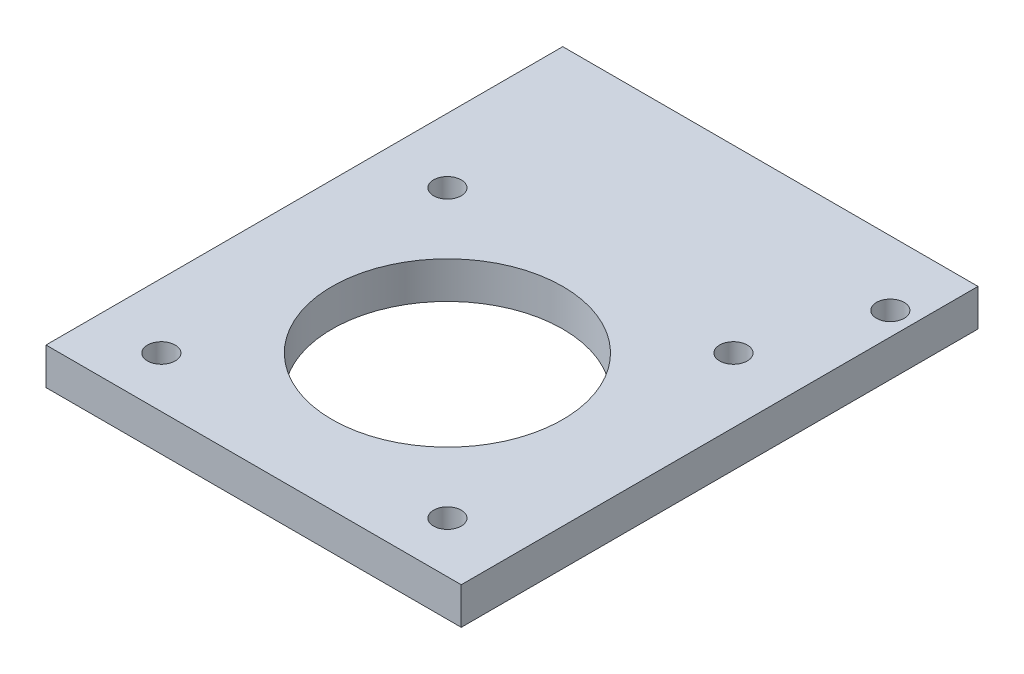
ISO-10303-21;
HEADER;
FILE_DESCRIPTION(('STEP AP214'),'2;1');
FILE_NAME('part.step','',(''),(''),'','','');
FILE_SCHEMA(('AUTOMOTIVE_DESIGN { 1 0 10303 214 1 1 1 1 }'));
ENDSEC;
DATA;
#1=APPLICATION_CONTEXT('core data for automotive mechanical design processes');
#2=APPLICATION_PROTOCOL_DEFINITION('international standard','automotive_design',2000,#1);
#3=PRODUCT_CONTEXT('',#1,'mechanical');
#4=PRODUCT('Part','Part','',(#3));
#5=PRODUCT_RELATED_PRODUCT_CATEGORY('part','',(#4));
#6=PRODUCT_DEFINITION_FORMATION('','',#4);
#7=PRODUCT_DEFINITION_CONTEXT('part definition',#1,'design');
#8=PRODUCT_DEFINITION('design','',#6,#7);
#9=PRODUCT_DEFINITION_SHAPE('','',#8);
#10=(LENGTH_UNIT() NAMED_UNIT(*) SI_UNIT(.MILLI.,.METRE.));
#11=(NAMED_UNIT(*) PLANE_ANGLE_UNIT() SI_UNIT($,.RADIAN.));
#12=(NAMED_UNIT(*) SI_UNIT($,.STERADIAN.) SOLID_ANGLE_UNIT());
#13=UNCERTAINTY_MEASURE_WITH_UNIT(LENGTH_MEASURE(1.E-05),#10,'distance_accuracy_value','');
#14=(GEOMETRIC_REPRESENTATION_CONTEXT(3) GLOBAL_UNCERTAINTY_ASSIGNED_CONTEXT((#13)) GLOBAL_UNIT_ASSIGNED_CONTEXT((#10,
#11,#12)) REPRESENTATION_CONTEXT('',''));
#15=CARTESIAN_POINT('',(0.,0.,0.));
#16=DIRECTION('',(0.,0.,1.));
#17=DIRECTION('',(1.,0.,0.));
#18=AXIS2_PLACEMENT_3D('',#15,#16,#17);
#19=CARTESIAN_POINT('',(22.5,4.,-28.));
#20=DIRECTION('',(-1.,0.,0.));
#21=DIRECTION('',(0.,0.,1.));
#22=AXIS2_PLACEMENT_3D('',#19,#20,#21);
#23=PLANE('',#22);
#24=DIRECTION('',(0.,0.,-1.));
#25=VECTOR('',#24,1.);
#26=CARTESIAN_POINT('',(22.5,0.,-28.));
#27=LINE('',#26,#25);
#28=CARTESIAN_POINT('',(22.5,0.,28.));
#29=VERTEX_POINT('',#28);
#30=CARTESIAN_POINT('',(22.5,0.,-28.));
#31=VERTEX_POINT('',#30);
#32=EDGE_CURVE('E98',#29,#31,#27,.T.);
#33=ORIENTED_EDGE('',*,*,#32,.T.);
#34=DIRECTION('',(0.,-1.,0.));
#35=VECTOR('',#34,1.);
#36=CARTESIAN_POINT('',(22.5,4.,-28.));
#37=LINE('',#36,#35);
#38=CARTESIAN_POINT('',(22.5,4.,-28.));
#39=VERTEX_POINT('',#38);
#40=EDGE_CURVE('E11',#39,#31,#37,.T.);
#41=ORIENTED_EDGE('',*,*,#40,.F.);
#42=DIRECTION('',(0.,0.,-1.));
#43=VECTOR('',#42,1.);
#44=CARTESIAN_POINT('',(22.5,4.,-28.));
#45=LINE('',#44,#43);
#46=CARTESIAN_POINT('',(22.5,4.,28.));
#47=VERTEX_POINT('',#46);
#48=EDGE_CURVE('E86',#47,#39,#45,.T.);
#49=ORIENTED_EDGE('',*,*,#48,.F.);
#50=DIRECTION('',(0.,-1.,0.));
#51=VECTOR('',#50,1.);
#52=CARTESIAN_POINT('',(22.5,4.,28.));
#53=LINE('',#52,#51);
#54=EDGE_CURVE('E94',#47,#29,#53,.T.);
#55=ORIENTED_EDGE('',*,*,#54,.T.);
#56=EDGE_LOOP('',(#33,#41,#49,#55));
#57=FACE_BOUND('',#56,.T.);
#58=ADVANCED_FACE('F35',(#57),#23,.F.);
#59=CARTESIAN_POINT('',(-22.5,4.,-28.));
#60=DIRECTION('',(0.,0.,1.));
#61=DIRECTION('',(1.,0.,0.));
#62=AXIS2_PLACEMENT_3D('',#59,#60,#61);
#63=PLANE('',#62);
#64=DIRECTION('',(-1.,0.,0.));
#65=VECTOR('',#64,1.);
#66=CARTESIAN_POINT('',(-22.5,0.,-28.));
#67=LINE('',#66,#65);
#68=CARTESIAN_POINT('',(-22.5,0.,-28.));
#69=VERTEX_POINT('',#68);
#70=EDGE_CURVE('E90',#31,#69,#67,.T.);
#71=ORIENTED_EDGE('',*,*,#70,.T.);
#72=DIRECTION('',(0.,-1.,0.));
#73=VECTOR('',#72,1.);
#74=CARTESIAN_POINT('',(-22.5,4.,-28.));
#75=LINE('',#74,#73);
#76=CARTESIAN_POINT('',(-22.5,4.,-28.));
#77=VERTEX_POINT('',#76);
#78=EDGE_CURVE('E43',#77,#69,#75,.T.);
#79=ORIENTED_EDGE('',*,*,#78,.F.);
#80=DIRECTION('',(-1.,0.,0.));
#81=VECTOR('',#80,1.);
#82=CARTESIAN_POINT('',(-22.5,4.,-28.));
#83=LINE('',#82,#81);
#84=EDGE_CURVE('E81',#39,#77,#83,.T.);
#85=ORIENTED_EDGE('',*,*,#84,.F.);
#86=ORIENTED_EDGE('',*,*,#40,.T.);
#87=EDGE_LOOP('',(#71,#79,#85,#86));
#88=FACE_BOUND('',#87,.T.);
#89=ADVANCED_FACE('F89',(#88),#63,.F.);
#90=CARTESIAN_POINT('',(-22.5,4.,-28.));
#91=DIRECTION('',(1.,0.,0.));
#92=DIRECTION('',(0.,0.,-1.));
#93=AXIS2_PLACEMENT_3D('',#90,#91,#92);
#94=PLANE('',#93);
#95=DIRECTION('',(0.,0.,1.));
#96=VECTOR('',#95,1.);
#97=CARTESIAN_POINT('',(-22.5,0.,-28.));
#98=LINE('',#97,#96);
#99=CARTESIAN_POINT('',(-22.5,0.,28.));
#100=VERTEX_POINT('',#99);
#101=EDGE_CURVE('E68',#69,#100,#98,.T.);
#102=ORIENTED_EDGE('',*,*,#101,.T.);
#103=DIRECTION('',(0.,-1.,0.));
#104=VECTOR('',#103,1.);
#105=CARTESIAN_POINT('',(-22.5,4.,28.));
#106=LINE('',#105,#104);
#107=CARTESIAN_POINT('',(-22.5,4.,28.));
#108=VERTEX_POINT('',#107);
#109=EDGE_CURVE('E91',#108,#100,#106,.T.);
#110=ORIENTED_EDGE('',*,*,#109,.F.);
#111=DIRECTION('',(0.,0.,1.));
#112=VECTOR('',#111,1.);
#113=CARTESIAN_POINT('',(-22.5,4.,-28.));
#114=LINE('',#113,#112);
#115=EDGE_CURVE('E84',#77,#108,#114,.T.);
#116=ORIENTED_EDGE('',*,*,#115,.F.);
#117=ORIENTED_EDGE('',*,*,#78,.T.);
#118=EDGE_LOOP('',(#102,#110,#116,#117));
#119=FACE_BOUND('',#118,.T.);
#120=ADVANCED_FACE('F92',(#119),#94,.F.);
#121=CARTESIAN_POINT('',(-22.5,4.,28.));
#122=DIRECTION('',(0.,0.,-1.));
#123=DIRECTION('',(-1.,0.,0.));
#124=AXIS2_PLACEMENT_3D('',#121,#122,#123);
#125=PLANE('',#124);
#126=DIRECTION('',(1.,0.,0.));
#127=VECTOR('',#126,1.);
#128=CARTESIAN_POINT('',(-22.5,0.,28.));
#129=LINE('',#128,#127);
#130=EDGE_CURVE('E74',#100,#29,#129,.T.);
#131=ORIENTED_EDGE('',*,*,#130,.T.);
#132=ORIENTED_EDGE('',*,*,#54,.F.);
#133=DIRECTION('',(1.,0.,0.));
#134=VECTOR('',#133,1.);
#135=CARTESIAN_POINT('',(-22.5,4.,28.));
#136=LINE('',#135,#134);
#137=EDGE_CURVE('E51',#108,#47,#136,.T.);
#138=ORIENTED_EDGE('',*,*,#137,.F.);
#139=ORIENTED_EDGE('',*,*,#109,.T.);
#140=EDGE_LOOP('',(#131,#132,#138,#139));
#141=FACE_BOUND('',#140,.T.);
#142=ADVANCED_FACE('F106',(#141),#125,.F.);
#143=CARTESIAN_POINT('',(0.,4.,0.));
#144=DIRECTION('',(0.,1.,0.));
#145=DIRECTION('',(0.,0.,1.));
#146=AXIS2_PLACEMENT_3D('',#143,#144,#145);
#147=PLANE('',#146);
#148=CARTESIAN_POINT('',(-15.5,4.,22.5));
#149=DIRECTION('',(0.,1.,0.));
#150=DIRECTION('',(0.,0.,1.));
#151=AXIS2_PLACEMENT_3D('',#148,#149,#150);
#152=CIRCLE('',#151,1.5);
#153=CARTESIAN_POINT('',(-15.5,4.,24.));
#154=VERTEX_POINT('',#153);
#155=EDGE_CURVE('E142',#154,#154,#152,.T.);
#156=ORIENTED_EDGE('',*,*,#155,.F.);
#157=EDGE_LOOP('',(#156));
#158=FACE_BOUND('',#157,.T.);
#159=CARTESIAN_POINT('',(15.5,4.,22.5));
#160=DIRECTION('',(0.,1.,0.));
#161=DIRECTION('',(0.,0.,1.));
#162=AXIS2_PLACEMENT_3D('',#159,#160,#161);
#163=CIRCLE('',#162,1.5);
#164=CARTESIAN_POINT('',(15.5,4.,24.));
#165=VERTEX_POINT('',#164);
#166=EDGE_CURVE('E125',#165,#165,#163,.T.);
#167=ORIENTED_EDGE('',*,*,#166,.F.);
#168=EDGE_LOOP('',(#167));
#169=FACE_BOUND('',#168,.T.);
#170=CARTESIAN_POINT('',(0.,4.,7.));
#171=DIRECTION('',(0.,1.,0.));
#172=DIRECTION('',(0.,0.,1.));
#173=AXIS2_PLACEMENT_3D('',#170,#171,#172);
#174=CIRCLE('',#173,12.5);
#175=CARTESIAN_POINT('',(0.,4.,19.5));
#176=VERTEX_POINT('',#175);
#177=EDGE_CURVE('E126',#176,#176,#174,.T.);
#178=ORIENTED_EDGE('',*,*,#177,.F.);
#179=EDGE_LOOP('',(#178));
#180=FACE_BOUND('',#179,.T.);
#181=CARTESIAN_POINT('',(20.,4.,-21.));
#182=DIRECTION('',(0.,1.,0.));
#183=DIRECTION('',(0.,0.,1.));
#184=AXIS2_PLACEMENT_3D('',#181,#182,#183);
#185=CIRCLE('',#184,1.5);
#186=CARTESIAN_POINT('',(20.,4.,-19.5));
#187=VERTEX_POINT('',#186);
#188=EDGE_CURVE('E132',#187,#187,#185,.T.);
#189=ORIENTED_EDGE('',*,*,#188,.F.);
#190=EDGE_LOOP('',(#189));
#191=FACE_BOUND('',#190,.T.);
#192=CARTESIAN_POINT('',(15.5,4.,-8.5));
#193=DIRECTION('',(0.,1.,0.));
#194=DIRECTION('',(0.,0.,1.));
#195=AXIS2_PLACEMENT_3D('',#192,#193,#194);
#196=CIRCLE('',#195,1.5);
#197=CARTESIAN_POINT('',(15.5,4.,-7.));
#198=VERTEX_POINT('',#197);
#199=EDGE_CURVE('E118',#198,#198,#196,.T.);
#200=ORIENTED_EDGE('',*,*,#199,.F.);
#201=EDGE_LOOP('',(#200));
#202=FACE_BOUND('',#201,.T.);
#203=CARTESIAN_POINT('',(-15.5,4.,-8.5));
#204=DIRECTION('',(0.,1.,0.));
#205=DIRECTION('',(0.,0.,1.));
#206=AXIS2_PLACEMENT_3D('',#203,#204,#205);
#207=CIRCLE('',#206,1.5);
#208=CARTESIAN_POINT('',(-15.5,4.,-7.));
#209=VERTEX_POINT('',#208);
#210=EDGE_CURVE('E112',#209,#209,#207,.T.);
#211=ORIENTED_EDGE('',*,*,#210,.F.);
#212=EDGE_LOOP('',(#211));
#213=FACE_BOUND('',#212,.T.);
#214=ORIENTED_EDGE('',*,*,#48,.T.);
#215=ORIENTED_EDGE('',*,*,#84,.T.);
#216=ORIENTED_EDGE('',*,*,#115,.T.);
#217=ORIENTED_EDGE('',*,*,#137,.T.);
#218=EDGE_LOOP('',(#214,#215,#216,#217));
#219=FACE_BOUND('',#218,.T.);
#220=ADVANCED_FACE('F82',(#158,#169,#180,#191,#202,#213,#219),#147,.T.);
#221=CARTESIAN_POINT('',(0.,0.,0.));
#222=DIRECTION('',(0.,1.,0.));
#223=DIRECTION('',(0.,0.,1.));
#224=AXIS2_PLACEMENT_3D('',#221,#222,#223);
#225=PLANE('',#224);
#226=CARTESIAN_POINT('',(-15.5,0.,22.5));
#227=DIRECTION('',(0.,1.,0.));
#228=DIRECTION('',(0.,0.,1.));
#229=AXIS2_PLACEMENT_3D('',#226,#227,#228);
#230=CIRCLE('',#229,1.5);
#231=CARTESIAN_POINT('',(-15.5,0.,24.));
#232=VERTEX_POINT('',#231);
#233=EDGE_CURVE('E115',#232,#232,#230,.T.);
#234=ORIENTED_EDGE('',*,*,#233,.T.);
#235=EDGE_LOOP('',(#234));
#236=FACE_BOUND('',#235,.T.);
#237=CARTESIAN_POINT('',(15.5,0.,22.5));
#238=DIRECTION('',(0.,1.,0.));
#239=DIRECTION('',(0.,0.,1.));
#240=AXIS2_PLACEMENT_3D('',#237,#238,#239);
#241=CIRCLE('',#240,1.5);
#242=CARTESIAN_POINT('',(15.5,0.,24.));
#243=VERTEX_POINT('',#242);
#244=EDGE_CURVE('E139',#243,#243,#241,.T.);
#245=ORIENTED_EDGE('',*,*,#244,.T.);
#246=EDGE_LOOP('',(#245));
#247=FACE_BOUND('',#246,.T.);
#248=CARTESIAN_POINT('',(0.,0.,7.));
#249=DIRECTION('',(0.,1.,0.));
#250=DIRECTION('',(0.,0.,1.));
#251=AXIS2_PLACEMENT_3D('',#248,#249,#250);
#252=CIRCLE('',#251,12.5);
#253=CARTESIAN_POINT('',(0.,0.,19.5));
#254=VERTEX_POINT('',#253);
#255=EDGE_CURVE('E129',#254,#254,#252,.T.);
#256=ORIENTED_EDGE('',*,*,#255,.T.);
#257=EDGE_LOOP('',(#256));
#258=FACE_BOUND('',#257,.T.);
#259=CARTESIAN_POINT('',(20.,0.,-21.));
#260=DIRECTION('',(0.,1.,0.));
#261=DIRECTION('',(0.,0.,1.));
#262=AXIS2_PLACEMENT_3D('',#259,#260,#261);
#263=CIRCLE('',#262,1.5);
#264=CARTESIAN_POINT('',(20.,0.,-19.5));
#265=VERTEX_POINT('',#264);
#266=EDGE_CURVE('E122',#265,#265,#263,.T.);
#267=ORIENTED_EDGE('',*,*,#266,.T.);
#268=EDGE_LOOP('',(#267));
#269=FACE_BOUND('',#268,.T.);
#270=CARTESIAN_POINT('',(15.5,0.,-8.5));
#271=DIRECTION('',(0.,1.,0.));
#272=DIRECTION('',(0.,0.,1.));
#273=AXIS2_PLACEMENT_3D('',#270,#271,#272);
#274=CIRCLE('',#273,1.5);
#275=CARTESIAN_POINT('',(15.5,0.,-7.));
#276=VERTEX_POINT('',#275);
#277=EDGE_CURVE('E121',#276,#276,#274,.T.);
#278=ORIENTED_EDGE('',*,*,#277,.T.);
#279=EDGE_LOOP('',(#278));
#280=FACE_BOUND('',#279,.T.);
#281=CARTESIAN_POINT('',(-15.5,0.,-8.5));
#282=DIRECTION('',(0.,1.,0.));
#283=DIRECTION('',(0.,0.,1.));
#284=AXIS2_PLACEMENT_3D('',#281,#282,#283);
#285=CIRCLE('',#284,1.5);
#286=CARTESIAN_POINT('',(-15.5,0.,-7.));
#287=VERTEX_POINT('',#286);
#288=EDGE_CURVE('E101',#287,#287,#285,.T.);
#289=ORIENTED_EDGE('',*,*,#288,.T.);
#290=EDGE_LOOP('',(#289));
#291=FACE_BOUND('',#290,.T.);
#292=ORIENTED_EDGE('',*,*,#32,.F.);
#293=ORIENTED_EDGE('',*,*,#130,.F.);
#294=ORIENTED_EDGE('',*,*,#101,.F.);
#295=ORIENTED_EDGE('',*,*,#70,.F.);
#296=EDGE_LOOP('',(#292,#293,#294,#295));
#297=FACE_BOUND('',#296,.T.);
#298=ADVANCED_FACE('F109',(#236,#247,#258,#269,#280,#291,#297),#225,.F.);
#299=CARTESIAN_POINT('',(-15.5,0.,-8.5));
#300=DIRECTION('',(0.,1.,0.));
#301=DIRECTION('',(0.,0.,1.));
#302=AXIS2_PLACEMENT_3D('',#299,#300,#301);
#303=CYLINDRICAL_SURFACE('',#302,1.5);
#304=ORIENTED_EDGE('',*,*,#288,.F.);
#305=EDGE_LOOP('',(#304));
#306=FACE_BOUND('',#305,.T.);
#307=ORIENTED_EDGE('',*,*,#210,.T.);
#308=EDGE_LOOP('',(#307));
#309=FACE_BOUND('',#308,.T.);
#310=ADVANCED_FACE('F170',(#306,#309),#303,.F.);
#311=CARTESIAN_POINT('',(15.5,0.,-8.5));
#312=DIRECTION('',(0.,1.,0.));
#313=DIRECTION('',(0.,0.,1.));
#314=AXIS2_PLACEMENT_3D('',#311,#312,#313);
#315=CYLINDRICAL_SURFACE('',#314,1.5);
#316=ORIENTED_EDGE('',*,*,#277,.F.);
#317=EDGE_LOOP('',(#316));
#318=FACE_BOUND('',#317,.T.);
#319=ORIENTED_EDGE('',*,*,#199,.T.);
#320=EDGE_LOOP('',(#319));
#321=FACE_BOUND('',#320,.T.);
#322=ADVANCED_FACE('F172',(#318,#321),#315,.F.);
#323=CARTESIAN_POINT('',(20.,0.,-21.));
#324=DIRECTION('',(0.,1.,0.));
#325=DIRECTION('',(0.,0.,1.));
#326=AXIS2_PLACEMENT_3D('',#323,#324,#325);
#327=CYLINDRICAL_SURFACE('',#326,1.5);
#328=ORIENTED_EDGE('',*,*,#266,.F.);
#329=EDGE_LOOP('',(#328));
#330=FACE_BOUND('',#329,.T.);
#331=ORIENTED_EDGE('',*,*,#188,.T.);
#332=EDGE_LOOP('',(#331));
#333=FACE_BOUND('',#332,.T.);
#334=ADVANCED_FACE('F179',(#330,#333),#327,.F.);
#335=CARTESIAN_POINT('',(0.,0.,7.));
#336=DIRECTION('',(0.,1.,0.));
#337=DIRECTION('',(0.,0.,1.));
#338=AXIS2_PLACEMENT_3D('',#335,#336,#337);
#339=CYLINDRICAL_SURFACE('',#338,12.5);
#340=ORIENTED_EDGE('',*,*,#255,.F.);
#341=EDGE_LOOP('',(#340));
#342=FACE_BOUND('',#341,.T.);
#343=ORIENTED_EDGE('',*,*,#177,.T.);
#344=EDGE_LOOP('',(#343));
#345=FACE_BOUND('',#344,.T.);
#346=ADVANCED_FACE('F225',(#342,#345),#339,.F.);
#347=CARTESIAN_POINT('',(15.5,0.,22.5));
#348=DIRECTION('',(0.,1.,0.));
#349=DIRECTION('',(0.,0.,1.));
#350=AXIS2_PLACEMENT_3D('',#347,#348,#349);
#351=CYLINDRICAL_SURFACE('',#350,1.5);
#352=ORIENTED_EDGE('',*,*,#244,.F.);
#353=EDGE_LOOP('',(#352));
#354=FACE_BOUND('',#353,.T.);
#355=ORIENTED_EDGE('',*,*,#166,.T.);
#356=EDGE_LOOP('',(#355));
#357=FACE_BOUND('',#356,.T.);
#358=ADVANCED_FACE('F153',(#354,#357),#351,.F.);
#359=CARTESIAN_POINT('',(-15.5,0.,22.5));
#360=DIRECTION('',(0.,1.,0.));
#361=DIRECTION('',(0.,0.,1.));
#362=AXIS2_PLACEMENT_3D('',#359,#360,#361);
#363=CYLINDRICAL_SURFACE('',#362,1.5);
#364=ORIENTED_EDGE('',*,*,#233,.F.);
#365=EDGE_LOOP('',(#364));
#366=FACE_BOUND('',#365,.T.);
#367=ORIENTED_EDGE('',*,*,#155,.T.);
#368=EDGE_LOOP('',(#367));
#369=FACE_BOUND('',#368,.T.);
#370=ADVANCED_FACE('F150',(#366,#369),#363,.F.);
#371=CLOSED_SHELL('',(#58,#89,#120,#142,#220,#298,#310,#322,#334,#346,#358,#370));
#372=MANIFOLD_SOLID_BREP('B2',#371);
#373=ADVANCED_BREP_SHAPE_REPRESENTATION('',(#18,#372),#14);
#374=SHAPE_DEFINITION_REPRESENTATION(#9,#373);
ENDSEC;
END-ISO-10303-21;
